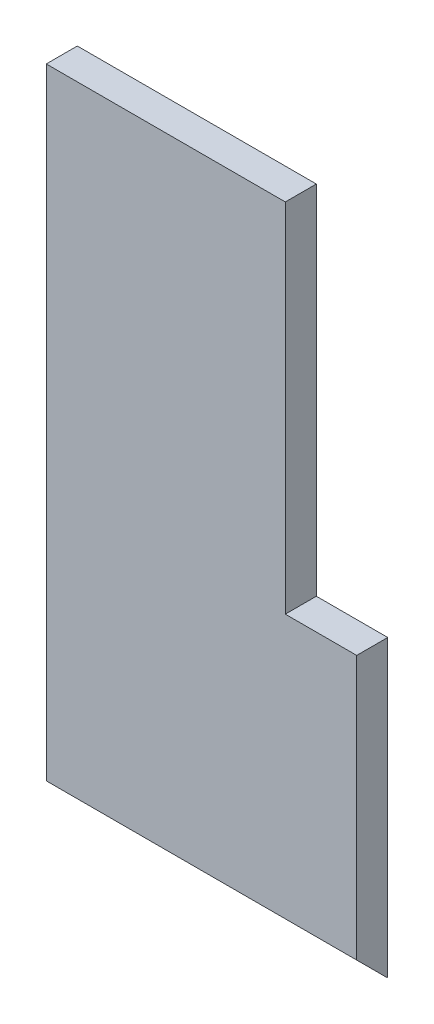
ISO-10303-21;
HEADER;
FILE_DESCRIPTION(('STEP AP214'),'2;1');
FILE_NAME('part.step','',(''),(''),'','','');
FILE_SCHEMA(('AUTOMOTIVE_DESIGN { 1 0 10303 214 1 1 1 1 }'));
ENDSEC;
DATA;
#1=APPLICATION_CONTEXT('core data for automotive mechanical design processes');
#2=APPLICATION_PROTOCOL_DEFINITION('international standard','automotive_design',2000,#1);
#3=PRODUCT_CONTEXT('',#1,'mechanical');
#4=PRODUCT('Part','Part','',(#3));
#5=PRODUCT_RELATED_PRODUCT_CATEGORY('part','',(#4));
#6=PRODUCT_DEFINITION_FORMATION('','',#4);
#7=PRODUCT_DEFINITION_CONTEXT('part definition',#1,'design');
#8=PRODUCT_DEFINITION('design','',#6,#7);
#9=PRODUCT_DEFINITION_SHAPE('','',#8);
#10=(LENGTH_UNIT() NAMED_UNIT(*) SI_UNIT(.MILLI.,.METRE.));
#11=(NAMED_UNIT(*) PLANE_ANGLE_UNIT() SI_UNIT($,.RADIAN.));
#12=(NAMED_UNIT(*) SI_UNIT($,.STERADIAN.) SOLID_ANGLE_UNIT());
#13=UNCERTAINTY_MEASURE_WITH_UNIT(LENGTH_MEASURE(1.E-05),#10,'distance_accuracy_value','');
#14=(GEOMETRIC_REPRESENTATION_CONTEXT(3) GLOBAL_UNCERTAINTY_ASSIGNED_CONTEXT((#13)) GLOBAL_UNIT_ASSIGNED_CONTEXT((#10,
#11,#12)) REPRESENTATION_CONTEXT('',''));
#15=CARTESIAN_POINT('',(0.,0.,0.));
#16=DIRECTION('',(0.,0.,1.));
#17=DIRECTION('',(1.,0.,0.));
#18=AXIS2_PLACEMENT_3D('',#15,#16,#17);
#19=CARTESIAN_POINT('',(-50.,-105.,10.));
#20=DIRECTION('',(-1.,0.,0.));
#21=DIRECTION('',(0.,0.,1.));
#22=AXIS2_PLACEMENT_3D('',#19,#20,#21);
#23=PLANE('',#22);
#24=DIRECTION('',(0.,0.707106781186544,0.707106781186551));
#25=VECTOR('',#24,1.);
#26=CARTESIAN_POINT('',(-50.,-105.,0.));
#27=LINE('',#26,#25);
#28=CARTESIAN_POINT('',(-50.,-105.,0.));
#29=VERTEX_POINT('',#28);
#30=CARTESIAN_POINT('',(-50.,-95.0000000000001,10.));
#31=VERTEX_POINT('',#30);
#32=EDGE_CURVE('E74',#29,#31,#27,.T.);
#33=ORIENTED_EDGE('',*,*,#32,.T.);
#34=DIRECTION('',(0.,1.,0.));
#35=VECTOR('',#34,1.);
#36=CARTESIAN_POINT('',(-50.,-105.,10.));
#37=LINE('',#36,#35);
#38=CARTESIAN_POINT('',(-50.,105.,10.));
#39=VERTEX_POINT('',#38);
#40=EDGE_CURVE('E80',#31,#39,#37,.T.);
#41=ORIENTED_EDGE('',*,*,#40,.T.);
#42=DIRECTION('',(0.,0.,-1.));
#43=VECTOR('',#42,1.);
#44=CARTESIAN_POINT('',(-50.,105.,10.));
#45=LINE('',#44,#43);
#46=CARTESIAN_POINT('',(-50.,105.,0.));
#47=VERTEX_POINT('',#46);
#48=EDGE_CURVE('E35',#39,#47,#45,.T.);
#49=ORIENTED_EDGE('',*,*,#48,.T.);
#50=DIRECTION('',(0.,1.,0.));
#51=VECTOR('',#50,1.);
#52=CARTESIAN_POINT('',(-50.,-105.,0.));
#53=LINE('',#52,#51);
#54=EDGE_CURVE('E95',#29,#47,#53,.T.);
#55=ORIENTED_EDGE('',*,*,#54,.F.);
#56=EDGE_LOOP('',(#33,#41,#49,#55));
#57=FACE_BOUND('',#56,.T.);
#58=ADVANCED_FACE('F32',(#57),#23,.T.);
#59=CARTESIAN_POINT('',(50.,-10.,10.));
#60=DIRECTION('',(1.,0.,0.));
#61=DIRECTION('',(0.,1.,0.));
#62=AXIS2_PLACEMENT_3D('',#59,#60,#61);
#63=PLANE('',#62);
#64=DIRECTION('',(0.,0.707106781186544,0.707106781186551));
#65=VECTOR('',#64,1.);
#66=CARTESIAN_POINT('',(50.,-105.,0.));
#67=LINE('',#66,#65);
#68=CARTESIAN_POINT('',(50.,-105.,0.));
#69=VERTEX_POINT('',#68);
#70=CARTESIAN_POINT('',(50.,-95.0000000000001,10.));
#71=VERTEX_POINT('',#70);
#72=EDGE_CURVE('E93',#69,#71,#67,.T.);
#73=ORIENTED_EDGE('',*,*,#72,.F.);
#74=DIRECTION('',(0.,-1.,0.));
#75=VECTOR('',#74,1.);
#76=CARTESIAN_POINT('',(50.,-10.,0.));
#77=LINE('',#76,#75);
#78=CARTESIAN_POINT('',(50.,-10.,0.));
#79=VERTEX_POINT('',#78);
#80=EDGE_CURVE('E109',#79,#69,#77,.T.);
#81=ORIENTED_EDGE('',*,*,#80,.F.);
#82=DIRECTION('',(0.,0.,-1.));
#83=VECTOR('',#82,1.);
#84=CARTESIAN_POINT('',(50.,-10.,10.));
#85=LINE('',#84,#83);
#86=CARTESIAN_POINT('',(50.,-10.,10.));
#87=VERTEX_POINT('',#86);
#88=EDGE_CURVE('E11',#87,#79,#85,.T.);
#89=ORIENTED_EDGE('',*,*,#88,.F.);
#90=DIRECTION('',(0.,-1.,0.));
#91=VECTOR('',#90,1.);
#92=CARTESIAN_POINT('',(50.,-10.,10.));
#93=LINE('',#92,#91);
#94=EDGE_CURVE('E117',#87,#71,#93,.T.);
#95=ORIENTED_EDGE('',*,*,#94,.T.);
#96=EDGE_LOOP('',(#73,#81,#89,#95));
#97=FACE_BOUND('',#96,.T.);
#98=ADVANCED_FACE('F138',(#97),#63,.T.);
#99=CARTESIAN_POINT('',(27.,-10.,10.));
#100=DIRECTION('',(0.,1.,0.));
#101=DIRECTION('',(0.,0.,1.));
#102=AXIS2_PLACEMENT_3D('',#99,#100,#101);
#103=PLANE('',#102);
#104=DIRECTION('',(1.,0.,0.));
#105=VECTOR('',#104,1.);
#106=CARTESIAN_POINT('',(27.,-10.,0.));
#107=LINE('',#106,#105);
#108=CARTESIAN_POINT('',(27.,-10.,0.));
#109=VERTEX_POINT('',#108);
#110=EDGE_CURVE('E126',#109,#79,#107,.T.);
#111=ORIENTED_EDGE('',*,*,#110,.F.);
#112=DIRECTION('',(0.,0.,-1.));
#113=VECTOR('',#112,1.);
#114=CARTESIAN_POINT('',(27.,-10.,10.));
#115=LINE('',#114,#113);
#116=CARTESIAN_POINT('',(27.,-10.,10.));
#117=VERTEX_POINT('',#116);
#118=EDGE_CURVE('E41',#117,#109,#115,.T.);
#119=ORIENTED_EDGE('',*,*,#118,.F.);
#120=DIRECTION('',(1.,0.,0.));
#121=VECTOR('',#120,1.);
#122=CARTESIAN_POINT('',(27.,-10.,10.));
#123=LINE('',#122,#121);
#124=EDGE_CURVE('E115',#117,#87,#123,.T.);
#125=ORIENTED_EDGE('',*,*,#124,.T.);
#126=ORIENTED_EDGE('',*,*,#88,.T.);
#127=EDGE_LOOP('',(#111,#119,#125,#126));
#128=FACE_BOUND('',#127,.T.);
#129=ADVANCED_FACE('F140',(#128),#103,.T.);
#130=CARTESIAN_POINT('',(27.,105.,10.));
#131=DIRECTION('',(1.,0.,0.));
#132=DIRECTION('',(0.,1.,0.));
#133=AXIS2_PLACEMENT_3D('',#130,#131,#132);
#134=PLANE('',#133);
#135=DIRECTION('',(0.,-1.,0.));
#136=VECTOR('',#135,1.);
#137=CARTESIAN_POINT('',(27.,105.,0.));
#138=LINE('',#137,#136);
#139=CARTESIAN_POINT('',(27.,105.,0.));
#140=VERTEX_POINT('',#139);
#141=EDGE_CURVE('E123',#140,#109,#138,.T.);
#142=ORIENTED_EDGE('',*,*,#141,.F.);
#143=DIRECTION('',(0.,0.,-1.));
#144=VECTOR('',#143,1.);
#145=CARTESIAN_POINT('',(27.,105.,10.));
#146=LINE('',#145,#144);
#147=CARTESIAN_POINT('',(27.,105.,10.));
#148=VERTEX_POINT('',#147);
#149=EDGE_CURVE('E131',#148,#140,#146,.T.);
#150=ORIENTED_EDGE('',*,*,#149,.F.);
#151=DIRECTION('',(0.,-1.,0.));
#152=VECTOR('',#151,1.);
#153=CARTESIAN_POINT('',(27.,105.,10.));
#154=LINE('',#153,#152);
#155=EDGE_CURVE('E107',#148,#117,#154,.T.);
#156=ORIENTED_EDGE('',*,*,#155,.T.);
#157=ORIENTED_EDGE('',*,*,#118,.T.);
#158=EDGE_LOOP('',(#142,#150,#156,#157));
#159=FACE_BOUND('',#158,.T.);
#160=ADVANCED_FACE('F142',(#159),#134,.T.);
#161=CARTESIAN_POINT('',(-50.,105.,10.));
#162=DIRECTION('',(0.,1.,0.));
#163=DIRECTION('',(0.,0.,1.));
#164=AXIS2_PLACEMENT_3D('',#161,#162,#163);
#165=PLANE('',#164);
#166=DIRECTION('',(1.,0.,0.));
#167=VECTOR('',#166,1.);
#168=CARTESIAN_POINT('',(-50.,105.,0.));
#169=LINE('',#168,#167);
#170=EDGE_CURVE('E120',#47,#140,#169,.T.);
#171=ORIENTED_EDGE('',*,*,#170,.F.);
#172=ORIENTED_EDGE('',*,*,#48,.F.);
#173=DIRECTION('',(1.,0.,0.));
#174=VECTOR('',#173,1.);
#175=CARTESIAN_POINT('',(-50.,105.,10.));
#176=LINE('',#175,#174);
#177=EDGE_CURVE('E104',#39,#148,#176,.T.);
#178=ORIENTED_EDGE('',*,*,#177,.T.);
#179=ORIENTED_EDGE('',*,*,#149,.T.);
#180=EDGE_LOOP('',(#171,#172,#178,#179));
#181=FACE_BOUND('',#180,.T.);
#182=ADVANCED_FACE('F135',(#181),#165,.T.);
#183=CARTESIAN_POINT('',(0.,0.,10.));
#184=DIRECTION('',(0.,0.,-1.));
#185=DIRECTION('',(-1.,0.,0.));
#186=AXIS2_PLACEMENT_3D('',#183,#184,#185);
#187=PLANE('',#186);
#188=ORIENTED_EDGE('',*,*,#40,.F.);
#189=DIRECTION('',(1.,0.,0.));
#190=VECTOR('',#189,1.);
#191=CARTESIAN_POINT('',(-50.,-95.0000000000001,10.));
#192=LINE('',#191,#190);
#193=EDGE_CURVE('E90',#31,#71,#192,.T.);
#194=ORIENTED_EDGE('',*,*,#193,.T.);
#195=ORIENTED_EDGE('',*,*,#94,.F.);
#196=ORIENTED_EDGE('',*,*,#124,.F.);
#197=ORIENTED_EDGE('',*,*,#155,.F.);
#198=ORIENTED_EDGE('',*,*,#177,.F.);
#199=EDGE_LOOP('',(#188,#194,#195,#196,#197,#198));
#200=FACE_BOUND('',#199,.T.);
#201=ADVANCED_FACE('F101',(#200),#187,.F.);
#202=CARTESIAN_POINT('',(0.,0.,0.));
#203=DIRECTION('',(0.,0.,-1.));
#204=DIRECTION('',(-1.,0.,0.));
#205=AXIS2_PLACEMENT_3D('',#202,#203,#204);
#206=PLANE('',#205);
#207=ORIENTED_EDGE('',*,*,#54,.T.);
#208=ORIENTED_EDGE('',*,*,#170,.T.);
#209=ORIENTED_EDGE('',*,*,#141,.T.);
#210=ORIENTED_EDGE('',*,*,#110,.T.);
#211=ORIENTED_EDGE('',*,*,#80,.T.);
#212=DIRECTION('',(1.,0.,0.));
#213=VECTOR('',#212,1.);
#214=CARTESIAN_POINT('',(-50.,-105.,0.));
#215=LINE('',#214,#213);
#216=EDGE_CURVE('E105',#29,#69,#215,.T.);
#217=ORIENTED_EDGE('',*,*,#216,.F.);
#218=EDGE_LOOP('',(#207,#208,#209,#210,#211,#217));
#219=FACE_BOUND('',#218,.T.);
#220=ADVANCED_FACE('F137',(#219),#206,.T.);
#221=CARTESIAN_POINT('',(-50.,-105.,0.));
#222=DIRECTION('',(0.,0.707106781186551,-0.707106781186544));
#223=DIRECTION('',(0.,0.707106781186544,0.707106781186551));
#224=AXIS2_PLACEMENT_3D('',#221,#222,#223);
#225=PLANE('',#224);
#226=ORIENTED_EDGE('',*,*,#72,.T.);
#227=ORIENTED_EDGE('',*,*,#193,.F.);
#228=ORIENTED_EDGE('',*,*,#32,.F.);
#229=ORIENTED_EDGE('',*,*,#216,.T.);
#230=EDGE_LOOP('',(#226,#227,#228,#229));
#231=FACE_BOUND('',#230,.T.);
#232=ADVANCED_FACE('F91',(#231),#225,.F.);
#233=CLOSED_SHELL('',(#58,#98,#129,#160,#182,#201,#220,#232));
#234=MANIFOLD_SOLID_BREP('B2',#233);
#235=ADVANCED_BREP_SHAPE_REPRESENTATION('',(#18,#234),#14);
#236=SHAPE_DEFINITION_REPRESENTATION(#9,#235);
ENDSEC;
END-ISO-10303-21;
